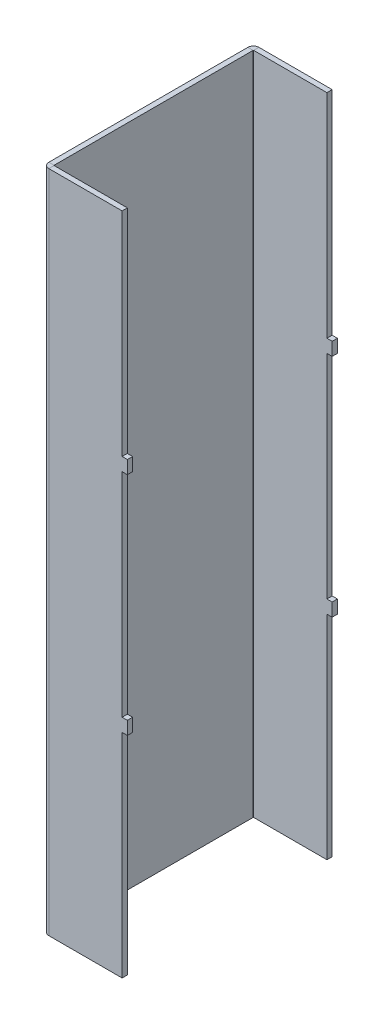
ISO-10303-21;
HEADER;
FILE_DESCRIPTION(('STEP AP214'),'2;1');
FILE_NAME('part.step','',(''),(''),'','','');
FILE_SCHEMA(('AUTOMOTIVE_DESIGN { 1 0 10303 214 1 1 1 1 }'));
ENDSEC;
DATA;
#1=APPLICATION_CONTEXT('core data for automotive mechanical design processes');
#2=APPLICATION_PROTOCOL_DEFINITION('international standard','automotive_design',2000,#1);
#3=PRODUCT_CONTEXT('',#1,'mechanical');
#4=PRODUCT('Part','Part','',(#3));
#5=PRODUCT_RELATED_PRODUCT_CATEGORY('part','',(#4));
#6=PRODUCT_DEFINITION_FORMATION('','',#4);
#7=PRODUCT_DEFINITION_CONTEXT('part definition',#1,'design');
#8=PRODUCT_DEFINITION('design','',#6,#7);
#9=PRODUCT_DEFINITION_SHAPE('','',#8);
#10=(LENGTH_UNIT() NAMED_UNIT(*) SI_UNIT(.MILLI.,.METRE.));
#11=(NAMED_UNIT(*) PLANE_ANGLE_UNIT() SI_UNIT($,.RADIAN.));
#12=(NAMED_UNIT(*) SI_UNIT($,.STERADIAN.) SOLID_ANGLE_UNIT());
#13=UNCERTAINTY_MEASURE_WITH_UNIT(LENGTH_MEASURE(1.E-05),#10,'distance_accuracy_value','');
#14=(GEOMETRIC_REPRESENTATION_CONTEXT(3) GLOBAL_UNCERTAINTY_ASSIGNED_CONTEXT((#13)) GLOBAL_UNIT_ASSIGNED_CONTEXT((#10,
#11,#12)) REPRESENTATION_CONTEXT('',''));
#15=CARTESIAN_POINT('',(0.,0.,0.));
#16=DIRECTION('',(0.,0.,1.));
#17=DIRECTION('',(1.,0.,0.));
#18=AXIS2_PLACEMENT_3D('',#15,#16,#17);
#19=CARTESIAN_POINT('',(498.000000000014,94.9999999999999,-1302.0213832608));
#20=DIRECTION('',(0.,1.,0.));
#21=DIRECTION('',(1.,0.,0.));
#22=AXIS2_PLACEMENT_3D('',#19,#20,#21);
#23=PLANE('',#22);
#24=DIRECTION('',(-1.,0.,0.));
#25=VECTOR('',#24,1.);
#26=CARTESIAN_POINT('',(498.000000000015,95.,-792.5));
#27=LINE('',#26,#25);
#28=CARTESIAN_POINT('',(500.000000000029,94.9999999999999,-792.5));
#29=VERTEX_POINT('',#28);
#30=CARTESIAN_POINT('',(498.000000000015,95.,-792.5));
#31=VERTEX_POINT('',#30);
#32=EDGE_CURVE('E433',#29,#31,#27,.T.);
#33=ORIENTED_EDGE('',*,*,#32,.F.);
#34=DIRECTION('',(0.,0.,1.));
#35=VECTOR('',#34,1.);
#36=CARTESIAN_POINT('',(500.000000000029,94.9999999999999,-1302.0213832608));
#37=LINE('',#36,#35);
#38=CARTESIAN_POINT('',(500.000000000029,95.,-794.5));
#39=VERTEX_POINT('',#38);
#40=EDGE_CURVE('E341',#39,#29,#37,.T.);
#41=ORIENTED_EDGE('',*,*,#40,.F.);
#42=DIRECTION('',(-1.,0.,0.));
#43=VECTOR('',#42,1.);
#44=CARTESIAN_POINT('',(498.000000000014,95.,-794.5));
#45=LINE('',#44,#43);
#46=CARTESIAN_POINT('',(498.000000000014,95.,-794.5));
#47=VERTEX_POINT('',#46);
#48=EDGE_CURVE('E351',#39,#47,#45,.T.);
#49=ORIENTED_EDGE('',*,*,#48,.T.);
#50=DIRECTION('',(0.,0.,1.));
#51=VECTOR('',#50,1.);
#52=CARTESIAN_POINT('',(498.000000000014,94.9999999999999,-1302.0213832608));
#53=LINE('',#52,#51);
#54=EDGE_CURVE('E350',#47,#31,#53,.T.);
#55=ORIENTED_EDGE('',*,*,#54,.T.);
#56=EDGE_LOOP('',(#33,#41,#49,#55));
#57=FACE_BOUND('',#56,.T.);
#58=ADVANCED_FACE('F47',(#57),#23,.T.);
#59=CARTESIAN_POINT('',(500.000000000029,94.9999999999999,-1302.0213832608));
#60=DIRECTION('',(1.,0.,0.));
#61=DIRECTION('',(0.,0.,-1.));
#62=AXIS2_PLACEMENT_3D('',#59,#60,#61);
#63=PLANE('',#62);
#64=DIRECTION('',(0.,1.,0.));
#65=VECTOR('',#64,1.);
#66=CARTESIAN_POINT('',(500.000000000029,94.9999999999999,-792.5));
#67=LINE('',#66,#65);
#68=CARTESIAN_POINT('',(500.000000000029,89.9999999999999,-792.499999999999));
#69=VERTEX_POINT('',#68);
#70=EDGE_CURVE('E449',#69,#29,#67,.T.);
#71=ORIENTED_EDGE('',*,*,#70,.F.);
#72=DIRECTION('',(0.,0.,1.));
#73=VECTOR('',#72,1.);
#74=CARTESIAN_POINT('',(500.000000000029,89.9999999999999,-1302.0213832608));
#75=LINE('',#74,#73);
#76=CARTESIAN_POINT('',(500.000000000029,90.,-794.499999999999));
#77=VERTEX_POINT('',#76);
#78=EDGE_CURVE('E333',#77,#69,#75,.T.);
#79=ORIENTED_EDGE('',*,*,#78,.F.);
#80=DIRECTION('',(0.,1.,0.));
#81=VECTOR('',#80,1.);
#82=CARTESIAN_POINT('',(500.000000000029,95.,-794.5));
#83=LINE('',#82,#81);
#84=EDGE_CURVE('E345',#77,#39,#83,.T.);
#85=ORIENTED_EDGE('',*,*,#84,.T.);
#86=ORIENTED_EDGE('',*,*,#40,.T.);
#87=EDGE_LOOP('',(#71,#79,#85,#86));
#88=FACE_BOUND('',#87,.T.);
#89=ADVANCED_FACE('F731',(#88),#63,.T.);
#90=CARTESIAN_POINT('',(498.000000000014,89.9999999999999,-1302.0213832608));
#91=DIRECTION('',(0.,-1.,0.));
#92=DIRECTION('',(-1.,0.,0.));
#93=AXIS2_PLACEMENT_3D('',#90,#91,#92);
#94=PLANE('',#93);
#95=DIRECTION('',(1.,0.,0.));
#96=VECTOR('',#95,1.);
#97=CARTESIAN_POINT('',(498.000000000015,90.,-792.499999999999));
#98=LINE('',#97,#96);
#99=CARTESIAN_POINT('',(498.000000000015,90.,-792.499999999999));
#100=VERTEX_POINT('',#99);
#101=EDGE_CURVE('E446',#100,#69,#98,.T.);
#102=ORIENTED_EDGE('',*,*,#101,.F.);
#103=DIRECTION('',(0.,0.,1.));
#104=VECTOR('',#103,1.);
#105=CARTESIAN_POINT('',(498.000000000014,89.9999999999999,-1302.0213832608));
#106=LINE('',#105,#104);
#107=CARTESIAN_POINT('',(498.000000000014,90.,-794.499999999999));
#108=VERTEX_POINT('',#107);
#109=EDGE_CURVE('E329',#108,#100,#106,.T.);
#110=ORIENTED_EDGE('',*,*,#109,.F.);
#111=DIRECTION('',(1.,0.,0.));
#112=VECTOR('',#111,1.);
#113=CARTESIAN_POINT('',(498.000000000014,90.,-794.499999999999));
#114=LINE('',#113,#112);
#115=EDGE_CURVE('E336',#108,#77,#114,.T.);
#116=ORIENTED_EDGE('',*,*,#115,.T.);
#117=ORIENTED_EDGE('',*,*,#78,.T.);
#118=EDGE_LOOP('',(#102,#110,#116,#117));
#119=FACE_BOUND('',#118,.T.);
#120=ADVANCED_FACE('F736',(#119),#94,.T.);
#121=CARTESIAN_POINT('',(498.000000000015,-163.440037453175,-1302.0213832608));
#122=DIRECTION('',(1.,0.,0.));
#123=DIRECTION('',(0.,0.,-1.));
#124=AXIS2_PLACEMENT_3D('',#121,#122,#123);
#125=PLANE('',#124);
#126=DIRECTION('',(0.,1.,0.));
#127=VECTOR('',#126,1.);
#128=CARTESIAN_POINT('',(498.000000000014,-163.440037453176,-792.5));
#129=LINE('',#128,#127);
#130=CARTESIAN_POINT('',(498.000000000014,8.99999999999995,-792.5));
#131=VERTEX_POINT('',#130);
#132=EDGE_CURVE('E432',#131,#100,#129,.T.);
#133=ORIENTED_EDGE('',*,*,#132,.F.);
#134=DIRECTION('',(0.,0.,1.));
#135=VECTOR('',#134,1.);
#136=CARTESIAN_POINT('',(498.000000000014,8.99999999999997,-1302.0213832608));
#137=LINE('',#136,#135);
#138=CARTESIAN_POINT('',(498.000000000014,8.99999999999997,-794.5));
#139=VERTEX_POINT('',#138);
#140=EDGE_CURVE('E328',#139,#131,#137,.T.);
#141=ORIENTED_EDGE('',*,*,#140,.F.);
#142=DIRECTION('',(0.,1.,0.));
#143=VECTOR('',#142,1.);
#144=CARTESIAN_POINT('',(498.000000000015,-163.440037453176,-794.5));
#145=LINE('',#144,#143);
#146=EDGE_CURVE('E305',#139,#108,#145,.T.);
#147=ORIENTED_EDGE('',*,*,#146,.T.);
#148=ORIENTED_EDGE('',*,*,#109,.T.);
#149=EDGE_LOOP('',(#133,#141,#147,#148));
#150=FACE_BOUND('',#149,.T.);
#151=ADVANCED_FACE('F745',(#150),#125,.T.);
#152=CARTESIAN_POINT('',(498.000000000014,8.99999999999997,-1302.0213832608));
#153=DIRECTION('',(0.,1.,0.));
#154=DIRECTION('',(1.,0.,0.));
#155=AXIS2_PLACEMENT_3D('',#152,#153,#154);
#156=PLANE('',#155);
#157=DIRECTION('',(-1.,0.,0.));
#158=VECTOR('',#157,1.);
#159=CARTESIAN_POINT('',(498.000000000014,8.99999999999997,-792.5));
#160=LINE('',#159,#158);
#161=CARTESIAN_POINT('',(500.000000000029,8.99999999999986,-792.5));
#162=VERTEX_POINT('',#161);
#163=EDGE_CURVE('E451',#162,#131,#160,.T.);
#164=ORIENTED_EDGE('',*,*,#163,.F.);
#165=DIRECTION('',(0.,0.,1.));
#166=VECTOR('',#165,1.);
#167=CARTESIAN_POINT('',(500.000000000029,8.99999999999997,-1302.0213832608));
#168=LINE('',#167,#166);
#169=CARTESIAN_POINT('',(500.000000000029,8.99999999999986,-794.5));
#170=VERTEX_POINT('',#169);
#171=EDGE_CURVE('E804',#170,#162,#168,.T.);
#172=ORIENTED_EDGE('',*,*,#171,.F.);
#173=DIRECTION('',(-1.,0.,0.));
#174=VECTOR('',#173,1.);
#175=CARTESIAN_POINT('',(498.000000000014,8.99999999999997,-794.5));
#176=LINE('',#175,#174);
#177=EDGE_CURVE('E322',#170,#139,#176,.T.);
#178=ORIENTED_EDGE('',*,*,#177,.T.);
#179=ORIENTED_EDGE('',*,*,#140,.T.);
#180=EDGE_LOOP('',(#164,#172,#178,#179));
#181=FACE_BOUND('',#180,.T.);
#182=ADVANCED_FACE('F753',(#181),#156,.T.);
#183=CARTESIAN_POINT('',(500.000000000029,8.99999999999997,-1302.0213832608));
#184=DIRECTION('',(1.,0.,0.));
#185=DIRECTION('',(0.,0.,-1.));
#186=AXIS2_PLACEMENT_3D('',#183,#184,#185);
#187=PLANE('',#186);
#188=DIRECTION('',(0.,1.,0.));
#189=VECTOR('',#188,1.);
#190=CARTESIAN_POINT('',(500.000000000029,8.99999999999986,-792.5));
#191=LINE('',#190,#189);
#192=CARTESIAN_POINT('',(500.000000000029,3.99999999999995,-792.499999999999));
#193=VERTEX_POINT('',#192);
#194=EDGE_CURVE('E455',#193,#162,#191,.T.);
#195=ORIENTED_EDGE('',*,*,#194,.F.);
#196=DIRECTION('',(0.,0.,1.));
#197=VECTOR('',#196,1.);
#198=CARTESIAN_POINT('',(500.000000000029,3.99999999999996,-1302.0213832608));
#199=LINE('',#198,#197);
#200=CARTESIAN_POINT('',(500.000000000029,3.99999999999985,-794.499999999999));
#201=VERTEX_POINT('',#200);
#202=EDGE_CURVE('E304',#201,#193,#199,.T.);
#203=ORIENTED_EDGE('',*,*,#202,.F.);
#204=DIRECTION('',(0.,1.,0.));
#205=VECTOR('',#204,1.);
#206=CARTESIAN_POINT('',(500.000000000029,8.99999999999986,-794.5));
#207=LINE('',#206,#205);
#208=EDGE_CURVE('E805',#201,#170,#207,.T.);
#209=ORIENTED_EDGE('',*,*,#208,.T.);
#210=ORIENTED_EDGE('',*,*,#171,.T.);
#211=EDGE_LOOP('',(#195,#203,#209,#210));
#212=FACE_BOUND('',#211,.T.);
#213=ADVANCED_FACE('F756',(#212),#187,.T.);
#214=CARTESIAN_POINT('',(498.000000000014,3.99999999999996,-1302.0213832608));
#215=DIRECTION('',(0.,-1.,0.));
#216=DIRECTION('',(-1.,0.,0.));
#217=AXIS2_PLACEMENT_3D('',#214,#215,#216);
#218=PLANE('',#217);
#219=DIRECTION('',(1.,0.,0.));
#220=VECTOR('',#219,1.);
#221=CARTESIAN_POINT('',(498.000000000014,3.99999999999996,-792.499999999999));
#222=LINE('',#221,#220);
#223=CARTESIAN_POINT('',(498.000000000014,3.99999999999996,-792.499999999999));
#224=VERTEX_POINT('',#223);
#225=EDGE_CURVE('E431',#224,#193,#222,.T.);
#226=ORIENTED_EDGE('',*,*,#225,.F.);
#227=DIRECTION('',(0.,0.,1.));
#228=VECTOR('',#227,1.);
#229=CARTESIAN_POINT('',(498.000000000014,3.99999999999996,-1302.0213832608));
#230=LINE('',#229,#228);
#231=CARTESIAN_POINT('',(498.000000000014,3.99999999999996,-794.499999999999));
#232=VERTEX_POINT('',#231);
#233=EDGE_CURVE('E303',#232,#224,#230,.T.);
#234=ORIENTED_EDGE('',*,*,#233,.F.);
#235=DIRECTION('',(1.,0.,0.));
#236=VECTOR('',#235,1.);
#237=CARTESIAN_POINT('',(498.000000000014,3.99999999999996,-794.499999999999));
#238=LINE('',#237,#236);
#239=EDGE_CURVE('E798',#232,#201,#238,.T.);
#240=ORIENTED_EDGE('',*,*,#239,.T.);
#241=ORIENTED_EDGE('',*,*,#202,.T.);
#242=EDGE_LOOP('',(#226,#234,#240,#241));
#243=FACE_BOUND('',#242,.T.);
#244=ADVANCED_FACE('F751',(#243),#218,.T.);
#245=CARTESIAN_POINT('',(498.000000000014,-77.0000000000001,-792.5));
#246=VERTEX_POINT('',#245);
#247=EDGE_CURVE('E128',#246,#224,#129,.T.);
#248=ORIENTED_EDGE('',*,*,#247,.F.);
#249=DIRECTION('',(0.,0.,1.));
#250=VECTOR('',#249,1.);
#251=CARTESIAN_POINT('',(498.000000000014,-77.,-1302.0213832608));
#252=LINE('',#251,#250);
#253=CARTESIAN_POINT('',(498.000000000014,-77.,-794.5));
#254=VERTEX_POINT('',#253);
#255=EDGE_CURVE('E419',#254,#246,#252,.T.);
#256=ORIENTED_EDGE('',*,*,#255,.F.);
#257=EDGE_CURVE('E67',#254,#232,#145,.T.);
#258=ORIENTED_EDGE('',*,*,#257,.T.);
#259=ORIENTED_EDGE('',*,*,#233,.T.);
#260=EDGE_LOOP('',(#248,#256,#258,#259));
#261=FACE_BOUND('',#260,.T.);
#262=ADVANCED_FACE('F747',(#261),#125,.T.);
#263=CARTESIAN_POINT('',(498.000000000014,176.,-792.499999999999));
#264=VERTEX_POINT('',#263);
#265=EDGE_CURVE('E284',#31,#264,#129,.T.);
#266=ORIENTED_EDGE('',*,*,#265,.F.);
#267=ORIENTED_EDGE('',*,*,#54,.F.);
#268=CARTESIAN_POINT('',(498.000000000014,176.,-794.499999999999));
#269=VERTEX_POINT('',#268);
#270=EDGE_CURVE('E296',#47,#269,#145,.T.);
#271=ORIENTED_EDGE('',*,*,#270,.T.);
#272=DIRECTION('',(0.,0.,1.));
#273=VECTOR('',#272,1.);
#274=CARTESIAN_POINT('',(498.000000000015,176.,-1302.0213832608));
#275=LINE('',#274,#273);
#276=EDGE_CURVE('E293',#269,#264,#275,.T.);
#277=ORIENTED_EDGE('',*,*,#276,.T.);
#278=EDGE_LOOP('',(#266,#267,#271,#277));
#279=FACE_BOUND('',#278,.T.);
#280=ADVANCED_FACE('F750',(#279),#125,.T.);
#281=CARTESIAN_POINT('',(498.000000000015,176.,-1302.0213832608));
#282=DIRECTION('',(0.,-1.,0.));
#283=DIRECTION('',(-1.,0.,0.));
#284=AXIS2_PLACEMENT_3D('',#281,#282,#283);
#285=PLANE('',#284);
#286=DIRECTION('',(0.,0.,1.));
#287=VECTOR('',#286,1.);
#288=CARTESIAN_POINT('',(470.100000000015,176.,-1302.0213832608));
#289=LINE('',#288,#287);
#290=CARTESIAN_POINT('',(470.100000000015,176.,-794.5));
#291=VERTEX_POINT('',#290);
#292=CARTESIAN_POINT('',(470.100000000014,176.,-792.5));
#293=VERTEX_POINT('',#292);
#294=EDGE_CURVE('E274',#291,#293,#289,.T.);
#295=ORIENTED_EDGE('',*,*,#294,.T.);
#296=DIRECTION('',(-1.,0.,0.));
#297=VECTOR('',#296,1.);
#298=CARTESIAN_POINT('',(498.000000000014,176.,-792.499999999999));
#299=LINE('',#298,#297);
#300=EDGE_CURVE('E267',#264,#293,#299,.T.);
#301=ORIENTED_EDGE('',*,*,#300,.F.);
#302=ORIENTED_EDGE('',*,*,#276,.F.);
#303=DIRECTION('',(1.,0.,0.));
#304=VECTOR('',#303,1.);
#305=CARTESIAN_POINT('',(498.000000000014,176.,-794.499999999999));
#306=LINE('',#305,#304);
#307=EDGE_CURVE('E12',#291,#269,#306,.T.);
#308=ORIENTED_EDGE('',*,*,#307,.F.);
#309=EDGE_LOOP('',(#295,#301,#302,#308));
#310=FACE_BOUND('',#309,.T.);
#311=ADVANCED_FACE('F291',(#310),#285,.F.);
#312=CARTESIAN_POINT('',(498.000000000014,-163.440037453176,-792.5));
#313=DIRECTION('',(0.,0.,-1.));
#314=DIRECTION('',(-1.,0.,0.));
#315=AXIS2_PLACEMENT_3D('',#312,#313,#314);
#316=PLANE('',#315);
#317=ORIENTED_EDGE('',*,*,#300,.T.);
#318=DIRECTION('',(0.,-1.,0.));
#319=VECTOR('',#318,1.);
#320=CARTESIAN_POINT('',(470.100000000014,176.,-792.5));
#321=LINE('',#320,#319);
#322=CARTESIAN_POINT('',(470.100000000014,-77.0000000000001,-792.499999999999));
#323=VERTEX_POINT('',#322);
#324=EDGE_CURVE('E257',#293,#323,#321,.T.);
#325=ORIENTED_EDGE('',*,*,#324,.T.);
#326=DIRECTION('',(-1.,0.,0.));
#327=VECTOR('',#326,1.);
#328=CARTESIAN_POINT('',(498.000000000014,-77.0000000000001,-792.5));
#329=LINE('',#328,#327);
#330=EDGE_CURVE('E133',#246,#323,#329,.T.);
#331=ORIENTED_EDGE('',*,*,#330,.F.);
#332=ORIENTED_EDGE('',*,*,#247,.T.);
#333=ORIENTED_EDGE('',*,*,#225,.T.);
#334=ORIENTED_EDGE('',*,*,#194,.T.);
#335=ORIENTED_EDGE('',*,*,#163,.T.);
#336=ORIENTED_EDGE('',*,*,#132,.T.);
#337=ORIENTED_EDGE('',*,*,#101,.T.);
#338=ORIENTED_EDGE('',*,*,#70,.T.);
#339=ORIENTED_EDGE('',*,*,#32,.T.);
#340=ORIENTED_EDGE('',*,*,#265,.T.);
#341=EDGE_LOOP('',(#317,#325,#331,#332,#333,#334,#335,#336,#337,#338,#339,#340));
#342=FACE_BOUND('',#341,.T.);
#343=ADVANCED_FACE('F282',(#342),#316,.F.);
#344=CARTESIAN_POINT('',(498.000000000014,-77.,-1302.0213832608));
#345=DIRECTION('',(0.,1.,0.));
#346=DIRECTION('',(1.,0.,0.));
#347=AXIS2_PLACEMENT_3D('',#344,#345,#346);
#348=PLANE('',#347);
#349=ORIENTED_EDGE('',*,*,#255,.T.);
#350=ORIENTED_EDGE('',*,*,#330,.T.);
#351=DIRECTION('',(0.,0.,1.));
#352=VECTOR('',#351,1.);
#353=CARTESIAN_POINT('',(470.100000000014,-77.,-1302.0213832608));
#354=LINE('',#353,#352);
#355=CARTESIAN_POINT('',(470.100000000015,-77.,-794.499999999999));
#356=VERTEX_POINT('',#355);
#357=EDGE_CURVE('E51',#356,#323,#354,.T.);
#358=ORIENTED_EDGE('',*,*,#357,.F.);
#359=DIRECTION('',(-1.,0.,0.));
#360=VECTOR('',#359,1.);
#361=CARTESIAN_POINT('',(498.000000000015,-77.,-794.5));
#362=LINE('',#361,#360);
#363=EDGE_CURVE('E412',#254,#356,#362,.T.);
#364=ORIENTED_EDGE('',*,*,#363,.F.);
#365=EDGE_LOOP('',(#349,#350,#358,#364));
#366=FACE_BOUND('',#365,.T.);
#367=ADVANCED_FACE('F767',(#366),#348,.F.);
#368=CARTESIAN_POINT('',(498.000000000015,-163.440037453176,-794.5));
#369=DIRECTION('',(0.,0.,1.));
#370=DIRECTION('',(1.,0.,0.));
#371=AXIS2_PLACEMENT_3D('',#368,#369,#370);
#372=PLANE('',#371);
#373=ORIENTED_EDGE('',*,*,#363,.T.);
#374=DIRECTION('',(0.,1.,0.));
#375=VECTOR('',#374,1.);
#376=CARTESIAN_POINT('',(470.100000000014,176.,-794.5));
#377=LINE('',#376,#375);
#378=EDGE_CURVE('E58',#356,#291,#377,.T.);
#379=ORIENTED_EDGE('',*,*,#378,.T.);
#380=ORIENTED_EDGE('',*,*,#307,.T.);
#381=ORIENTED_EDGE('',*,*,#270,.F.);
#382=ORIENTED_EDGE('',*,*,#48,.F.);
#383=ORIENTED_EDGE('',*,*,#84,.F.);
#384=ORIENTED_EDGE('',*,*,#115,.F.);
#385=ORIENTED_EDGE('',*,*,#146,.F.);
#386=ORIENTED_EDGE('',*,*,#177,.F.);
#387=ORIENTED_EDGE('',*,*,#208,.F.);
#388=ORIENTED_EDGE('',*,*,#239,.F.);
#389=ORIENTED_EDGE('',*,*,#257,.F.);
#390=EDGE_LOOP('',(#373,#379,#380,#381,#382,#383,#384,#385,#386,#387,#388,#389));
#391=FACE_BOUND('',#390,.T.);
#392=ADVANCED_FACE('F49',(#391),#372,.F.);
#393=CARTESIAN_POINT('',(498.000000000015,3.99999999999996,-362.978616739202));
#394=DIRECTION('',(0.,-1.,0.));
#395=DIRECTION('',(1.,0.,0.));
#396=AXIS2_PLACEMENT_3D('',#393,#394,#395);
#397=PLANE('',#396);
#398=DIRECTION('',(-1.,0.,0.));
#399=VECTOR('',#398,1.);
#400=CARTESIAN_POINT('',(498.000000000015,3.99999999999996,-872.499999999999));
#401=LINE('',#400,#399);
#402=CARTESIAN_POINT('',(500.,3.99999999999985,-872.499999999999));
#403=VERTEX_POINT('',#402);
#404=CARTESIAN_POINT('',(498.000000000015,3.99999999999995,-872.499999999999));
#405=VERTEX_POINT('',#404);
#406=EDGE_CURVE('E601',#403,#405,#401,.T.);
#407=ORIENTED_EDGE('',*,*,#406,.F.);
#408=DIRECTION('',(0.,0.,-1.));
#409=VECTOR('',#408,1.);
#410=CARTESIAN_POINT('',(500.,3.99999999999985,-362.978616739202));
#411=LINE('',#410,#409);
#412=CARTESIAN_POINT('',(500.,3.99999999999985,-870.499999999999));
#413=VERTEX_POINT('',#412);
#414=EDGE_CURVE('E676',#413,#403,#411,.T.);
#415=ORIENTED_EDGE('',*,*,#414,.F.);
#416=DIRECTION('',(-1.,0.,0.));
#417=VECTOR('',#416,1.);
#418=CARTESIAN_POINT('',(498.000000000014,3.99999999999996,-870.499999999999));
#419=LINE('',#418,#417);
#420=CARTESIAN_POINT('',(498.000000000014,3.99999999999995,-870.499999999999));
#421=VERTEX_POINT('',#420);
#422=EDGE_CURVE('E394',#413,#421,#419,.T.);
#423=ORIENTED_EDGE('',*,*,#422,.T.);
#424=DIRECTION('',(0.,0.,-1.));
#425=VECTOR('',#424,1.);
#426=CARTESIAN_POINT('',(498.000000000015,3.99999999999995,-362.978616739202));
#427=LINE('',#426,#425);
#428=EDGE_CURVE('E399',#421,#405,#427,.T.);
#429=ORIENTED_EDGE('',*,*,#428,.T.);
#430=EDGE_LOOP('',(#407,#415,#423,#429));
#431=FACE_BOUND('',#430,.T.);
#432=ADVANCED_FACE('F691',(#431),#397,.T.);
#433=CARTESIAN_POINT('',(500.,8.99999999999986,-362.978616739202));
#434=DIRECTION('',(1.,0.,0.));
#435=DIRECTION('',(0.,0.,-1.));
#436=AXIS2_PLACEMENT_3D('',#433,#434,#435);
#437=PLANE('',#436);
#438=DIRECTION('',(0.,-1.,0.));
#439=VECTOR('',#438,1.);
#440=CARTESIAN_POINT('',(500.,8.99999999999986,-872.5));
#441=LINE('',#440,#439);
#442=CARTESIAN_POINT('',(500.,8.99999999999986,-872.5));
#443=VERTEX_POINT('',#442);
#444=EDGE_CURVE('E605',#443,#403,#441,.T.);
#445=ORIENTED_EDGE('',*,*,#444,.F.);
#446=DIRECTION('',(0.,0.,-1.));
#447=VECTOR('',#446,1.);
#448=CARTESIAN_POINT('',(500.,8.99999999999986,-362.978616739202));
#449=LINE('',#448,#447);
#450=CARTESIAN_POINT('',(500.,8.99999999999986,-870.5));
#451=VERTEX_POINT('',#450);
#452=EDGE_CURVE('E667',#451,#443,#449,.T.);
#453=ORIENTED_EDGE('',*,*,#452,.F.);
#454=DIRECTION('',(0.,-1.,0.));
#455=VECTOR('',#454,1.);
#456=CARTESIAN_POINT('',(500.,8.99999999999986,-870.5));
#457=LINE('',#456,#455);
#458=EDGE_CURVE('E679',#451,#413,#457,.T.);
#459=ORIENTED_EDGE('',*,*,#458,.T.);
#460=ORIENTED_EDGE('',*,*,#414,.T.);
#461=EDGE_LOOP('',(#445,#453,#459,#460));
#462=FACE_BOUND('',#461,.T.);
#463=ADVANCED_FACE('F852',(#462),#437,.T.);
#464=CARTESIAN_POINT('',(498.000000000015,8.99999999999997,-362.978616739202));
#465=DIRECTION('',(0.,1.,0.));
#466=DIRECTION('',(-1.,0.,0.));
#467=AXIS2_PLACEMENT_3D('',#464,#465,#466);
#468=PLANE('',#467);
#469=DIRECTION('',(1.,0.,0.));
#470=VECTOR('',#469,1.);
#471=CARTESIAN_POINT('',(498.000000000015,8.99999999999997,-872.5));
#472=LINE('',#471,#470);
#473=CARTESIAN_POINT('',(498.000000000015,8.99999999999997,-872.5));
#474=VERTEX_POINT('',#473);
#475=EDGE_CURVE('E612',#474,#443,#472,.T.);
#476=ORIENTED_EDGE('',*,*,#475,.F.);
#477=DIRECTION('',(0.,0.,-1.));
#478=VECTOR('',#477,1.);
#479=CARTESIAN_POINT('',(498.000000000015,8.99999999999994,-362.978616739202));
#480=LINE('',#479,#478);
#481=CARTESIAN_POINT('',(498.000000000015,8.99999999999995,-870.5));
#482=VERTEX_POINT('',#481);
#483=EDGE_CURVE('E663',#482,#474,#480,.T.);
#484=ORIENTED_EDGE('',*,*,#483,.F.);
#485=DIRECTION('',(1.,0.,0.));
#486=VECTOR('',#485,1.);
#487=CARTESIAN_POINT('',(498.000000000015,8.99999999999997,-870.5));
#488=LINE('',#487,#486);
#489=EDGE_CURVE('E671',#482,#451,#488,.T.);
#490=ORIENTED_EDGE('',*,*,#489,.T.);
#491=ORIENTED_EDGE('',*,*,#452,.T.);
#492=EDGE_LOOP('',(#476,#484,#490,#491));
#493=FACE_BOUND('',#492,.T.);
#494=ADVANCED_FACE('F728',(#493),#468,.T.);
#495=CARTESIAN_POINT('',(498.000000000014,-163.440037453176,-362.978616739202));
#496=DIRECTION('',(-1.,0.,0.));
#497=DIRECTION('',(0.,0.,1.));
#498=AXIS2_PLACEMENT_3D('',#495,#496,#497);
#499=PLANE('',#498);
#500=ORIENTED_EDGE('',*,*,#483,.T.);
#501=DIRECTION('',(0.,1.,0.));
#502=VECTOR('',#501,1.);
#503=CARTESIAN_POINT('',(498.000000000015,-163.440037453175,-872.5));
#504=LINE('',#503,#502);
#505=CARTESIAN_POINT('',(498.000000000015,90.,-872.499999999999));
#506=VERTEX_POINT('',#505);
#507=EDGE_CURVE('E662',#474,#506,#504,.T.);
#508=ORIENTED_EDGE('',*,*,#507,.T.);
#509=DIRECTION('',(0.,0.,-1.));
#510=VECTOR('',#509,1.);
#511=CARTESIAN_POINT('',(498.000000000015,89.9999999999999,-362.978616739202));
#512=LINE('',#511,#510);
#513=CARTESIAN_POINT('',(498.000000000015,90.,-870.499999999999));
#514=VERTEX_POINT('',#513);
#515=EDGE_CURVE('E636',#514,#506,#512,.T.);
#516=ORIENTED_EDGE('',*,*,#515,.F.);
#517=DIRECTION('',(0.,1.,0.));
#518=VECTOR('',#517,1.);
#519=CARTESIAN_POINT('',(498.000000000015,-163.440037453175,-870.5));
#520=LINE('',#519,#518);
#521=EDGE_CURVE('E365',#482,#514,#520,.T.);
#522=ORIENTED_EDGE('',*,*,#521,.F.);
#523=EDGE_LOOP('',(#500,#508,#516,#522));
#524=FACE_BOUND('',#523,.T.);
#525=ADVANCED_FACE('F718',(#524),#499,.F.);
#526=CARTESIAN_POINT('',(498.000000000015,89.9999999999999,-362.978616739202));
#527=DIRECTION('',(0.,-1.,0.));
#528=DIRECTION('',(1.,0.,0.));
#529=AXIS2_PLACEMENT_3D('',#526,#527,#528);
#530=PLANE('',#529);
#531=DIRECTION('',(-1.,0.,0.));
#532=VECTOR('',#531,1.);
#533=CARTESIAN_POINT('',(498.000000000015,90.,-872.499999999999));
#534=LINE('',#533,#532);
#535=CARTESIAN_POINT('',(500.,90.,-872.499999999999));
#536=VERTEX_POINT('',#535);
#537=EDGE_CURVE('E616',#536,#506,#534,.T.);
#538=ORIENTED_EDGE('',*,*,#537,.F.);
#539=DIRECTION('',(0.,0.,-1.));
#540=VECTOR('',#539,1.);
#541=CARTESIAN_POINT('',(500.,89.9999999999999,-362.978616739202));
#542=LINE('',#541,#540);
#543=CARTESIAN_POINT('',(500.,89.9999999999999,-870.499999999999));
#544=VERTEX_POINT('',#543);
#545=EDGE_CURVE('E634',#544,#536,#542,.T.);
#546=ORIENTED_EDGE('',*,*,#545,.F.);
#547=DIRECTION('',(-1.,0.,0.));
#548=VECTOR('',#547,1.);
#549=CARTESIAN_POINT('',(498.000000000015,90.,-870.499999999999));
#550=LINE('',#549,#548);
#551=EDGE_CURVE('E658',#544,#514,#550,.T.);
#552=ORIENTED_EDGE('',*,*,#551,.T.);
#553=ORIENTED_EDGE('',*,*,#515,.T.);
#554=EDGE_LOOP('',(#538,#546,#552,#553));
#555=FACE_BOUND('',#554,.T.);
#556=ADVANCED_FACE('F632',(#555),#530,.T.);
#557=CARTESIAN_POINT('',(500.,94.9999999999999,-362.978616739202));
#558=DIRECTION('',(1.,0.,0.));
#559=DIRECTION('',(0.,0.,-1.));
#560=AXIS2_PLACEMENT_3D('',#557,#558,#559);
#561=PLANE('',#560);
#562=DIRECTION('',(0.,-1.,0.));
#563=VECTOR('',#562,1.);
#564=CARTESIAN_POINT('',(500.,95.,-872.5));
#565=LINE('',#564,#563);
#566=CARTESIAN_POINT('',(500.,95.,-872.5));
#567=VERTEX_POINT('',#566);
#568=EDGE_CURVE('E583',#567,#536,#565,.T.);
#569=ORIENTED_EDGE('',*,*,#568,.F.);
#570=DIRECTION('',(0.,0.,-1.));
#571=VECTOR('',#570,1.);
#572=CARTESIAN_POINT('',(500.,94.9999999999999,-362.978616739202));
#573=LINE('',#572,#571);
#574=CARTESIAN_POINT('',(500.,94.9999999999999,-870.5));
#575=VERTEX_POINT('',#574);
#576=EDGE_CURVE('E646',#575,#567,#573,.T.);
#577=ORIENTED_EDGE('',*,*,#576,.F.);
#578=DIRECTION('',(0.,-1.,0.));
#579=VECTOR('',#578,1.);
#580=CARTESIAN_POINT('',(500.,94.9999999999999,-870.5));
#581=LINE('',#580,#579);
#582=EDGE_CURVE('E639',#575,#544,#581,.T.);
#583=ORIENTED_EDGE('',*,*,#582,.T.);
#584=ORIENTED_EDGE('',*,*,#545,.T.);
#585=EDGE_LOOP('',(#569,#577,#583,#584));
#586=FACE_BOUND('',#585,.T.);
#587=ADVANCED_FACE('F638',(#586),#561,.T.);
#588=CARTESIAN_POINT('',(498.000000000015,94.9999999999999,-362.978616739202));
#589=DIRECTION('',(0.,1.,0.));
#590=DIRECTION('',(-1.,0.,0.));
#591=AXIS2_PLACEMENT_3D('',#588,#589,#590);
#592=PLANE('',#591);
#593=DIRECTION('',(1.,0.,0.));
#594=VECTOR('',#593,1.);
#595=CARTESIAN_POINT('',(498.000000000015,95.,-872.5));
#596=LINE('',#595,#594);
#597=CARTESIAN_POINT('',(498.000000000015,95.,-872.5));
#598=VERTEX_POINT('',#597);
#599=EDGE_CURVE('E579',#598,#567,#596,.T.);
#600=ORIENTED_EDGE('',*,*,#599,.F.);
#601=DIRECTION('',(0.,0.,-1.));
#602=VECTOR('',#601,1.);
#603=CARTESIAN_POINT('',(498.000000000015,94.9999999999999,-362.978616739202));
#604=LINE('',#603,#602);
#605=CARTESIAN_POINT('',(498.000000000015,95.,-870.5));
#606=VERTEX_POINT('',#605);
#607=EDGE_CURVE('E706',#606,#598,#604,.T.);
#608=ORIENTED_EDGE('',*,*,#607,.F.);
#609=DIRECTION('',(1.,0.,0.));
#610=VECTOR('',#609,1.);
#611=CARTESIAN_POINT('',(498.000000000015,95.,-870.5));
#612=LINE('',#611,#610);
#613=EDGE_CURVE('E641',#606,#575,#612,.T.);
#614=ORIENTED_EDGE('',*,*,#613,.T.);
#615=ORIENTED_EDGE('',*,*,#576,.T.);
#616=EDGE_LOOP('',(#600,#608,#614,#615));
#617=FACE_BOUND('',#616,.T.);
#618=ADVANCED_FACE('F714',(#617),#592,.T.);
#619=ORIENTED_EDGE('',*,*,#607,.T.);
#620=CARTESIAN_POINT('',(498.000000000014,176.,-872.499999999999));
#621=VERTEX_POINT('',#620);
#622=EDGE_CURVE('E203',#598,#621,#504,.T.);
#623=ORIENTED_EDGE('',*,*,#622,.T.);
#624=DIRECTION('',(0.,0.,-1.));
#625=VECTOR('',#624,1.);
#626=CARTESIAN_POINT('',(498.000000000014,176.,-362.978616739202));
#627=LINE('',#626,#625);
#628=CARTESIAN_POINT('',(498.000000000014,176.,-870.499999999999));
#629=VERTEX_POINT('',#628);
#630=EDGE_CURVE('E570',#629,#621,#627,.T.);
#631=ORIENTED_EDGE('',*,*,#630,.F.);
#632=EDGE_CURVE('E141',#606,#629,#520,.T.);
#633=ORIENTED_EDGE('',*,*,#632,.F.);
#634=EDGE_LOOP('',(#619,#623,#631,#633));
#635=FACE_BOUND('',#634,.T.);
#636=ADVANCED_FACE('F715',(#635),#499,.F.);
#637=DIRECTION('',(0.,0.,-1.));
#638=VECTOR('',#637,1.);
#639=CARTESIAN_POINT('',(498.000000000015,-77.,-362.978616739202));
#640=LINE('',#639,#638);
#641=CARTESIAN_POINT('',(498.000000000015,-77.,-870.5));
#642=VERTEX_POINT('',#641);
#643=CARTESIAN_POINT('',(498.000000000015,-77.0000000000001,-872.5));
#644=VERTEX_POINT('',#643);
#645=EDGE_CURVE('E698',#642,#644,#640,.T.);
#646=ORIENTED_EDGE('',*,*,#645,.T.);
#647=EDGE_CURVE('E697',#644,#405,#504,.T.);
#648=ORIENTED_EDGE('',*,*,#647,.T.);
#649=ORIENTED_EDGE('',*,*,#428,.F.);
#650=EDGE_CURVE('E367',#642,#421,#520,.T.);
#651=ORIENTED_EDGE('',*,*,#650,.F.);
#652=EDGE_LOOP('',(#646,#648,#649,#651));
#653=FACE_BOUND('',#652,.T.);
#654=ADVANCED_FACE('F695',(#653),#499,.F.);
#655=CARTESIAN_POINT('',(470.000000000015,-77.0000000000001,-362.978616739202));
#656=DIRECTION('',(0.,1.,0.));
#657=DIRECTION('',(-1.,0.,0.));
#658=AXIS2_PLACEMENT_3D('',#655,#656,#657);
#659=PLANE('',#658);
#660=DIRECTION('',(0.,0.,-1.));
#661=VECTOR('',#660,1.);
#662=CARTESIAN_POINT('',(470.100000000015,-77.0000000000001,-362.978616739202));
#663=LINE('',#662,#661);
#664=CARTESIAN_POINT('',(470.100000000015,-77.0000000000001,-870.499999999999));
#665=VERTEX_POINT('',#664);
#666=CARTESIAN_POINT('',(470.100000000014,-77.0000000000001,-872.499999999999));
#667=VERTEX_POINT('',#666);
#668=EDGE_CURVE('E585',#665,#667,#663,.T.);
#669=ORIENTED_EDGE('',*,*,#668,.T.);
#670=DIRECTION('',(-1.,0.,0.));
#671=VECTOR('',#670,1.);
#672=CARTESIAN_POINT('',(468.000000000015,-77.0000000000001,-872.499999999999));
#673=LINE('',#672,#671);
#674=EDGE_CURVE('E576',#644,#667,#673,.T.);
#675=ORIENTED_EDGE('',*,*,#674,.F.);
#676=ORIENTED_EDGE('',*,*,#645,.F.);
#677=DIRECTION('',(1.,0.,0.));
#678=VECTOR('',#677,1.);
#679=CARTESIAN_POINT('',(470.000000000015,-77.,-870.5));
#680=LINE('',#679,#678);
#681=EDGE_CURVE('E373',#665,#642,#680,.T.);
#682=ORIENTED_EDGE('',*,*,#681,.F.);
#683=EDGE_LOOP('',(#669,#675,#676,#682));
#684=FACE_BOUND('',#683,.T.);
#685=ADVANCED_FACE('F723',(#684),#659,.F.);
#686=CARTESIAN_POINT('',(468.000000000015,-163.440037453176,-872.5));
#687=DIRECTION('',(0.,0.,1.));
#688=DIRECTION('',(1.,0.,0.));
#689=AXIS2_PLACEMENT_3D('',#686,#687,#688);
#690=PLANE('',#689);
#691=ORIENTED_EDGE('',*,*,#674,.T.);
#692=DIRECTION('',(0.,1.,0.));
#693=VECTOR('',#692,1.);
#694=CARTESIAN_POINT('',(470.100000000014,-77.,-872.499999999999));
#695=LINE('',#694,#693);
#696=CARTESIAN_POINT('',(470.100000000014,176.,-872.5));
#697=VERTEX_POINT('',#696);
#698=EDGE_CURVE('E573',#667,#697,#695,.T.);
#699=ORIENTED_EDGE('',*,*,#698,.T.);
#700=DIRECTION('',(-1.,0.,0.));
#701=VECTOR('',#700,1.);
#702=CARTESIAN_POINT('',(470.000000000014,176.,-872.5));
#703=LINE('',#702,#701);
#704=EDGE_CURVE('E207',#621,#697,#703,.T.);
#705=ORIENTED_EDGE('',*,*,#704,.F.);
#706=ORIENTED_EDGE('',*,*,#622,.F.);
#707=ORIENTED_EDGE('',*,*,#599,.T.);
#708=ORIENTED_EDGE('',*,*,#568,.T.);
#709=ORIENTED_EDGE('',*,*,#537,.T.);
#710=ORIENTED_EDGE('',*,*,#507,.F.);
#711=ORIENTED_EDGE('',*,*,#475,.T.);
#712=ORIENTED_EDGE('',*,*,#444,.T.);
#713=ORIENTED_EDGE('',*,*,#406,.T.);
#714=ORIENTED_EDGE('',*,*,#647,.F.);
#715=EDGE_LOOP('',(#691,#699,#705,#706,#707,#708,#709,#710,#711,#712,#713,#714));
#716=FACE_BOUND('',#715,.T.);
#717=ADVANCED_FACE('F574',(#716),#690,.F.);
#718=CARTESIAN_POINT('',(470.000000000015,176.,-362.978616739202));
#719=DIRECTION('',(0.,-1.,0.));
#720=DIRECTION('',(1.,0.,0.));
#721=AXIS2_PLACEMENT_3D('',#718,#719,#720);
#722=PLANE('',#721);
#723=ORIENTED_EDGE('',*,*,#630,.T.);
#724=ORIENTED_EDGE('',*,*,#704,.T.);
#725=DIRECTION('',(0.,0.,-1.));
#726=VECTOR('',#725,1.);
#727=CARTESIAN_POINT('',(470.100000000014,176.,-362.978616739202));
#728=LINE('',#727,#726);
#729=CARTESIAN_POINT('',(470.100000000015,176.,-870.5));
#730=VERTEX_POINT('',#729);
#731=EDGE_CURVE('E400',#730,#697,#728,.T.);
#732=ORIENTED_EDGE('',*,*,#731,.F.);
#733=DIRECTION('',(-1.,0.,0.));
#734=VECTOR('',#733,1.);
#735=CARTESIAN_POINT('',(470.000000000015,176.,-870.5));
#736=LINE('',#735,#734);
#737=EDGE_CURVE('E381',#629,#730,#736,.T.);
#738=ORIENTED_EDGE('',*,*,#737,.F.);
#739=EDGE_LOOP('',(#723,#724,#732,#738));
#740=FACE_BOUND('',#739,.T.);
#741=ADVANCED_FACE('F569',(#740),#722,.F.);
#742=CARTESIAN_POINT('',(470.000000000015,-163.440037453175,-870.5));
#743=DIRECTION('',(0.,0.,-1.));
#744=DIRECTION('',(-1.,0.,0.));
#745=AXIS2_PLACEMENT_3D('',#742,#743,#744);
#746=PLANE('',#745);
#747=ORIENTED_EDGE('',*,*,#737,.T.);
#748=DIRECTION('',(0.,-1.,0.));
#749=VECTOR('',#748,1.);
#750=CARTESIAN_POINT('',(470.100000000015,-77.,-870.499999999999));
#751=LINE('',#750,#749);
#752=EDGE_CURVE('E377',#730,#665,#751,.T.);
#753=ORIENTED_EDGE('',*,*,#752,.T.);
#754=ORIENTED_EDGE('',*,*,#681,.T.);
#755=ORIENTED_EDGE('',*,*,#650,.T.);
#756=ORIENTED_EDGE('',*,*,#422,.F.);
#757=ORIENTED_EDGE('',*,*,#458,.F.);
#758=ORIENTED_EDGE('',*,*,#489,.F.);
#759=ORIENTED_EDGE('',*,*,#521,.T.);
#760=ORIENTED_EDGE('',*,*,#551,.F.);
#761=ORIENTED_EDGE('',*,*,#582,.F.);
#762=ORIENTED_EDGE('',*,*,#613,.F.);
#763=ORIENTED_EDGE('',*,*,#632,.T.);
#764=EDGE_LOOP('',(#747,#753,#754,#755,#756,#757,#758,#759,#760,#761,#762,#763));
#765=FACE_BOUND('',#764,.T.);
#766=ADVANCED_FACE('F564',(#765),#746,.F.);
#767=CARTESIAN_POINT('',(996.222074510348,176.,-794.499999999999));
#768=DIRECTION('',(0.,-1.,0.));
#769=DIRECTION('',(0.,0.,-1.));
#770=AXIS2_PLACEMENT_3D('',#767,#768,#769);
#771=PLANE('',#770);
#772=DIRECTION('',(-1.,0.,0.));
#773=VECTOR('',#772,1.);
#774=CARTESIAN_POINT('',(996.222074510346,176.,-870.399999999999));
#775=LINE('',#774,#773);
#776=CARTESIAN_POINT('',(470.000000000015,176.,-870.4));
#777=VERTEX_POINT('',#776);
#778=CARTESIAN_POINT('',(468.000000000015,176.,-870.4));
#779=VERTEX_POINT('',#778);
#780=EDGE_CURVE('E520',#777,#779,#775,.T.);
#781=ORIENTED_EDGE('',*,*,#780,.T.);
#782=DIRECTION('',(0.,0.,-1.));
#783=VECTOR('',#782,1.);
#784=CARTESIAN_POINT('',(468.000000000014,176.,-792.5));
#785=LINE('',#784,#783);
#786=CARTESIAN_POINT('',(468.000000000015,176.,-794.6));
#787=VERTEX_POINT('',#786);
#788=EDGE_CURVE('E214',#787,#779,#785,.T.);
#789=ORIENTED_EDGE('',*,*,#788,.F.);
#790=DIRECTION('',(-1.,0.,0.));
#791=VECTOR('',#790,1.);
#792=CARTESIAN_POINT('',(996.222074510348,176.,-794.599999999999));
#793=LINE('',#792,#791);
#794=CARTESIAN_POINT('',(470.000000000015,176.,-794.6));
#795=VERTEX_POINT('',#794);
#796=EDGE_CURVE('E277',#795,#787,#793,.T.);
#797=ORIENTED_EDGE('',*,*,#796,.F.);
#798=DIRECTION('',(0.,0.,1.));
#799=VECTOR('',#798,1.);
#800=CARTESIAN_POINT('',(470.000000000015,176.,-794.5));
#801=LINE('',#800,#799);
#802=EDGE_CURVE('E529',#777,#795,#801,.T.);
#803=ORIENTED_EDGE('',*,*,#802,.F.);
#804=EDGE_LOOP('',(#781,#789,#797,#803));
#805=FACE_BOUND('',#804,.T.);
#806=ADVANCED_FACE('F549',(#805),#771,.F.);
#807=CARTESIAN_POINT('',(996.222074510348,-77.0000000000001,-794.5));
#808=DIRECTION('',(0.,1.,0.));
#809=DIRECTION('',(0.,0.,1.));
#810=AXIS2_PLACEMENT_3D('',#807,#808,#809);
#811=PLANE('',#810);
#812=DIRECTION('',(-1.,0.,0.));
#813=VECTOR('',#812,1.);
#814=CARTESIAN_POINT('',(996.222074510348,-77.0000000000001,-794.6));
#815=LINE('',#814,#813);
#816=CARTESIAN_POINT('',(470.000000000015,-77.,-794.6));
#817=VERTEX_POINT('',#816);
#818=CARTESIAN_POINT('',(468.000000000015,-77.,-794.599999999999));
#819=VERTEX_POINT('',#818);
#820=EDGE_CURVE('E512',#817,#819,#815,.T.);
#821=ORIENTED_EDGE('',*,*,#820,.T.);
#822=DIRECTION('',(0.,0.,1.));
#823=VECTOR('',#822,1.);
#824=CARTESIAN_POINT('',(468.000000000015,-77.0000000000001,-792.499999999999));
#825=LINE('',#824,#823);
#826=CARTESIAN_POINT('',(468.000000000014,-77.,-870.399999999999));
#827=VERTEX_POINT('',#826);
#828=EDGE_CURVE('E502',#827,#819,#825,.T.);
#829=ORIENTED_EDGE('',*,*,#828,.F.);
#830=DIRECTION('',(-1.,0.,0.));
#831=VECTOR('',#830,1.);
#832=CARTESIAN_POINT('',(996.222074510346,-77.0000000000001,-870.4));
#833=LINE('',#832,#831);
#834=CARTESIAN_POINT('',(470.000000000014,-77.0000000000001,-870.4));
#835=VERTEX_POINT('',#834);
#836=EDGE_CURVE('E509',#835,#827,#833,.T.);
#837=ORIENTED_EDGE('',*,*,#836,.F.);
#838=DIRECTION('',(0.,0.,-1.));
#839=VECTOR('',#838,1.);
#840=CARTESIAN_POINT('',(470.000000000015,-77.,-794.5));
#841=LINE('',#840,#839);
#842=EDGE_CURVE('E533',#817,#835,#841,.T.);
#843=ORIENTED_EDGE('',*,*,#842,.F.);
#844=EDGE_LOOP('',(#821,#829,#837,#843));
#845=FACE_BOUND('',#844,.T.);
#846=ADVANCED_FACE('F507',(#845),#811,.F.);
#847=CARTESIAN_POINT('',(470.000000000015,-163.440037453176,-794.5));
#848=DIRECTION('',(-1.,0.,0.));
#849=DIRECTION('',(0.,0.,1.));
#850=AXIS2_PLACEMENT_3D('',#847,#848,#849);
#851=PLANE('',#850);
#852=DIRECTION('',(0.,1.,0.));
#853=VECTOR('',#852,1.);
#854=CARTESIAN_POINT('',(470.000000000015,176.,-794.6));
#855=LINE('',#854,#853);
#856=EDGE_CURVE('E524',#817,#795,#855,.T.);
#857=ORIENTED_EDGE('',*,*,#856,.F.);
#858=ORIENTED_EDGE('',*,*,#842,.T.);
#859=DIRECTION('',(0.,-1.,0.));
#860=VECTOR('',#859,1.);
#861=CARTESIAN_POINT('',(470.000000000014,-77.,-870.4));
#862=LINE('',#861,#860);
#863=EDGE_CURVE('E222',#777,#835,#862,.T.);
#864=ORIENTED_EDGE('',*,*,#863,.F.);
#865=ORIENTED_EDGE('',*,*,#802,.T.);
#866=EDGE_LOOP('',(#857,#858,#864,#865));
#867=FACE_BOUND('',#866,.T.);
#868=ADVANCED_FACE('F843',(#867),#851,.F.);
#869=CARTESIAN_POINT('',(468.000000000014,-163.440037453176,-792.5));
#870=DIRECTION('',(1.,0.,0.));
#871=DIRECTION('',(0.,0.,-1.));
#872=AXIS2_PLACEMENT_3D('',#869,#870,#871);
#873=PLANE('',#872);
#874=DIRECTION('',(0.,-1.,0.));
#875=VECTOR('',#874,1.);
#876=CARTESIAN_POINT('',(468.000000000015,176.,-794.6));
#877=LINE('',#876,#875);
#878=EDGE_CURVE('E536',#787,#819,#877,.T.);
#879=ORIENTED_EDGE('',*,*,#878,.F.);
#880=ORIENTED_EDGE('',*,*,#788,.T.);
#881=DIRECTION('',(0.,1.,0.));
#882=VECTOR('',#881,1.);
#883=CARTESIAN_POINT('',(468.000000000014,-77.,-870.399999999999));
#884=LINE('',#883,#882);
#885=EDGE_CURVE('E403',#827,#779,#884,.T.);
#886=ORIENTED_EDGE('',*,*,#885,.F.);
#887=ORIENTED_EDGE('',*,*,#828,.T.);
#888=EDGE_LOOP('',(#879,#880,#886,#887));
#889=FACE_BOUND('',#888,.T.);
#890=ADVANCED_FACE('F501',(#889),#873,.F.);
#891=CARTESIAN_POINT('',(470.100000000014,-77.0000000000001,-870.399999999999));
#892=DIRECTION('',(0.,-1.,0.));
#893=DIRECTION('',(0.,0.,-1.));
#894=AXIS2_PLACEMENT_3D('',#891,#892,#893);
#895=PLANE('',#894);
#896=ORIENTED_EDGE('',*,*,#668,.F.);
#897=CARTESIAN_POINT('',(470.100000000014,-77.0000000000001,-870.399999999999));
#898=DIRECTION('',(0.,1.,0.));
#899=DIRECTION('',(0.,0.,1.));
#900=AXIS2_PLACEMENT_3D('',#897,#898,#899);
#901=CIRCLE('',#900,0.100000000000057);
#902=EDGE_CURVE('E471',#665,#835,#901,.T.);
#903=ORIENTED_EDGE('',*,*,#902,.T.);
#904=ORIENTED_EDGE('',*,*,#836,.T.);
#905=CARTESIAN_POINT('',(470.100000000014,-77.0000000000001,-870.399999999999));
#906=DIRECTION('',(0.,1.,0.));
#907=DIRECTION('',(0.,0.,1.));
#908=AXIS2_PLACEMENT_3D('',#905,#906,#907);
#909=CIRCLE('',#908,2.10000000000006);
#910=EDGE_CURVE('E499',#667,#827,#909,.T.);
#911=ORIENTED_EDGE('',*,*,#910,.F.);
#912=EDGE_LOOP('',(#896,#903,#904,#911));
#913=FACE_BOUND('',#912,.T.);
#914=ADVANCED_FACE('F516',(#913),#895,.T.);
#915=CARTESIAN_POINT('',(470.100000000015,176.,-870.4));
#916=DIRECTION('',(0.,1.,0.));
#917=DIRECTION('',(0.,0.,1.));
#918=AXIS2_PLACEMENT_3D('',#915,#916,#917);
#919=PLANE('',#918);
#920=CARTESIAN_POINT('',(470.100000000015,176.,-870.4));
#921=DIRECTION('',(0.,1.,0.));
#922=DIRECTION('',(0.,0.,1.));
#923=AXIS2_PLACEMENT_3D('',#920,#921,#922);
#924=CIRCLE('',#923,0.100000000000057);
#925=EDGE_CURVE('E544',#777,#730,#924,.F.);
#926=ORIENTED_EDGE('',*,*,#925,.T.);
#927=ORIENTED_EDGE('',*,*,#731,.T.);
#928=CARTESIAN_POINT('',(470.100000000015,176.,-870.4));
#929=DIRECTION('',(0.,1.,0.));
#930=DIRECTION('',(0.,0.,1.));
#931=AXIS2_PLACEMENT_3D('',#928,#929,#930);
#932=CIRCLE('',#931,2.10000000000006);
#933=EDGE_CURVE('E497',#779,#697,#932,.F.);
#934=ORIENTED_EDGE('',*,*,#933,.F.);
#935=ORIENTED_EDGE('',*,*,#780,.F.);
#936=EDGE_LOOP('',(#926,#927,#934,#935));
#937=FACE_BOUND('',#936,.T.);
#938=ADVANCED_FACE('F554',(#937),#919,.T.);
#939=CARTESIAN_POINT('',(470.100000000015,-364.813898205073,-870.4));
#940=DIRECTION('',(0.,1.,0.));
#941=DIRECTION('',(0.,0.,1.));
#942=AXIS2_PLACEMENT_3D('',#939,#940,#941);
#943=CYLINDRICAL_SURFACE('',#942,2.10000000000006);
#944=ORIENTED_EDGE('',*,*,#885,.T.);
#945=ORIENTED_EDGE('',*,*,#933,.T.);
#946=ORIENTED_EDGE('',*,*,#698,.F.);
#947=ORIENTED_EDGE('',*,*,#910,.T.);
#948=EDGE_LOOP('',(#944,#945,#946,#947));
#949=FACE_BOUND('',#948,.T.);
#950=ADVANCED_FACE('F495',(#949),#943,.T.);
#951=CARTESIAN_POINT('',(470.100000000015,-364.813898205073,-870.4));
#952=DIRECTION('',(0.,1.,0.));
#953=DIRECTION('',(0.,0.,1.));
#954=AXIS2_PLACEMENT_3D('',#951,#952,#953);
#955=CYLINDRICAL_SURFACE('',#954,0.100000000000057);
#956=ORIENTED_EDGE('',*,*,#863,.T.);
#957=ORIENTED_EDGE('',*,*,#902,.F.);
#958=ORIENTED_EDGE('',*,*,#752,.F.);
#959=ORIENTED_EDGE('',*,*,#925,.F.);
#960=EDGE_LOOP('',(#956,#957,#958,#959));
#961=FACE_BOUND('',#960,.T.);
#962=ADVANCED_FACE('F829',(#961),#955,.F.);
#963=CARTESIAN_POINT('',(470.100000000015,176.,-794.6));
#964=DIRECTION('',(0.,1.,0.));
#965=DIRECTION('',(0.,0.,1.));
#966=AXIS2_PLACEMENT_3D('',#963,#964,#965);
#967=PLANE('',#966);
#968=ORIENTED_EDGE('',*,*,#294,.F.);
#969=CARTESIAN_POINT('',(470.100000000015,176.,-794.6));
#970=DIRECTION('',(0.,-1.,0.));
#971=DIRECTION('',(0.,0.,-1.));
#972=AXIS2_PLACEMENT_3D('',#969,#970,#971);
#973=CIRCLE('',#972,0.0999999999999858);
#974=EDGE_CURVE('E472',#291,#795,#973,.T.);
#975=ORIENTED_EDGE('',*,*,#974,.T.);
#976=ORIENTED_EDGE('',*,*,#796,.T.);
#977=CARTESIAN_POINT('',(470.100000000015,176.,-794.6));
#978=DIRECTION('',(0.,-1.,0.));
#979=DIRECTION('',(0.,0.,-1.));
#980=AXIS2_PLACEMENT_3D('',#977,#978,#979);
#981=CIRCLE('',#980,2.09999999999999);
#982=EDGE_CURVE('E261',#293,#787,#981,.T.);
#983=ORIENTED_EDGE('',*,*,#982,.F.);
#984=EDGE_LOOP('',(#968,#975,#976,#983));
#985=FACE_BOUND('',#984,.T.);
#986=ADVANCED_FACE('F271',(#985),#967,.T.);
#987=CARTESIAN_POINT('',(470.100000000015,-77.,-794.599999999999));
#988=DIRECTION('',(0.,-1.,0.));
#989=DIRECTION('',(0.,0.,-1.));
#990=AXIS2_PLACEMENT_3D('',#987,#988,#989);
#991=PLANE('',#990);
#992=CARTESIAN_POINT('',(470.100000000015,-77.,-794.599999999999));
#993=DIRECTION('',(0.,-1.,0.));
#994=DIRECTION('',(0.,0.,-1.));
#995=AXIS2_PLACEMENT_3D('',#992,#993,#994);
#996=CIRCLE('',#995,0.0999999999999858);
#997=EDGE_CURVE('E279',#817,#356,#996,.F.);
#998=ORIENTED_EDGE('',*,*,#997,.T.);
#999=ORIENTED_EDGE('',*,*,#357,.T.);
#1000=CARTESIAN_POINT('',(470.100000000015,-77.,-794.599999999999));
#1001=DIRECTION('',(0.,-1.,0.));
#1002=DIRECTION('',(0.,0.,-1.));
#1003=AXIS2_PLACEMENT_3D('',#1000,#1001,#1002);
#1004=CIRCLE('',#1003,2.09999999999999);
#1005=EDGE_CURVE('E263',#819,#323,#1004,.F.);
#1006=ORIENTED_EDGE('',*,*,#1005,.F.);
#1007=ORIENTED_EDGE('',*,*,#820,.F.);
#1008=EDGE_LOOP('',(#998,#999,#1006,#1007));
#1009=FACE_BOUND('',#1008,.T.);
#1010=ADVANCED_FACE('F820',(#1009),#991,.T.);
#1011=CARTESIAN_POINT('',(470.100000000015,453.176766703132,-794.599999999999));
#1012=DIRECTION('',(0.,-1.,0.));
#1013=DIRECTION('',(0.,0.,-1.));
#1014=AXIS2_PLACEMENT_3D('',#1011,#1012,#1013);
#1015=CYLINDRICAL_SURFACE('',#1014,2.09999999999999);
#1016=ORIENTED_EDGE('',*,*,#878,.T.);
#1017=ORIENTED_EDGE('',*,*,#1005,.T.);
#1018=ORIENTED_EDGE('',*,*,#324,.F.);
#1019=ORIENTED_EDGE('',*,*,#982,.T.);
#1020=EDGE_LOOP('',(#1016,#1017,#1018,#1019));
#1021=FACE_BOUND('',#1020,.T.);
#1022=ADVANCED_FACE('F260',(#1021),#1015,.T.);
#1023=CARTESIAN_POINT('',(470.100000000015,453.176766703132,-794.599999999999));
#1024=DIRECTION('',(0.,-1.,0.));
#1025=DIRECTION('',(0.,0.,-1.));
#1026=AXIS2_PLACEMENT_3D('',#1023,#1024,#1025);
#1027=CYLINDRICAL_SURFACE('',#1026,0.0999999999999858);
#1028=ORIENTED_EDGE('',*,*,#856,.T.);
#1029=ORIENTED_EDGE('',*,*,#974,.F.);
#1030=ORIENTED_EDGE('',*,*,#378,.F.);
#1031=ORIENTED_EDGE('',*,*,#997,.F.);
#1032=EDGE_LOOP('',(#1028,#1029,#1030,#1031));
#1033=FACE_BOUND('',#1032,.T.);
#1034=ADVANCED_FACE('F819',(#1033),#1027,.F.);
#1035=CLOSED_SHELL('',(#58,#89,#120,#151,#182,#213,#244,#262,#280,#311,#343,#367,#392,#432,#463,
#494,#525,#556,#587,#618,#636,#654,#685,#717,#741,#766,#806,#846,#868,#890,#914,#938,#950,#962,
#986,#1010,#1022,#1034));
#1036=MANIFOLD_SOLID_BREP('B2',#1035);
#1037=ADVANCED_BREP_SHAPE_REPRESENTATION('',(#18,#1036),#14);
#1038=SHAPE_DEFINITION_REPRESENTATION(#9,#1037);
ENDSEC;
END-ISO-10303-21;
